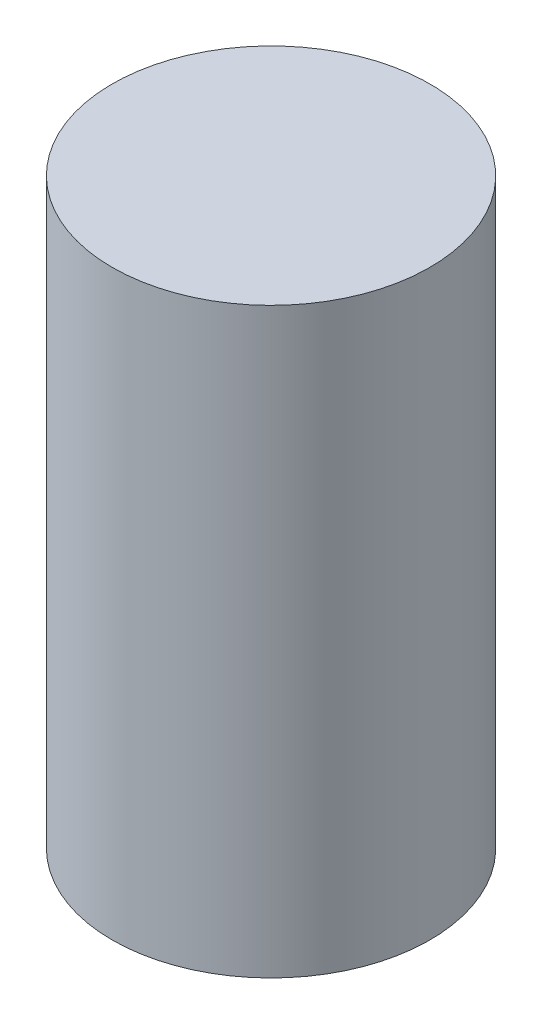
ISO-10303-21;
HEADER;
FILE_DESCRIPTION(('STEP AP214'),'2;1');
FILE_NAME('part.step','',(''),(''),'','','');
FILE_SCHEMA(('AUTOMOTIVE_DESIGN { 1 0 10303 214 1 1 1 1 }'));
ENDSEC;
DATA;
#1=APPLICATION_CONTEXT('core data for automotive mechanical design processes');
#2=APPLICATION_PROTOCOL_DEFINITION('international standard','automotive_design',2000,#1);
#3=PRODUCT_CONTEXT('',#1,'mechanical');
#4=PRODUCT('Part','Part','',(#3));
#5=PRODUCT_RELATED_PRODUCT_CATEGORY('part','',(#4));
#6=PRODUCT_DEFINITION_FORMATION('','',#4);
#7=PRODUCT_DEFINITION_CONTEXT('part definition',#1,'design');
#8=PRODUCT_DEFINITION('design','',#6,#7);
#9=PRODUCT_DEFINITION_SHAPE('','',#8);
#10=(LENGTH_UNIT() NAMED_UNIT(*) SI_UNIT(.MILLI.,.METRE.));
#11=(NAMED_UNIT(*) PLANE_ANGLE_UNIT() SI_UNIT($,.RADIAN.));
#12=(NAMED_UNIT(*) SI_UNIT($,.STERADIAN.) SOLID_ANGLE_UNIT());
#13=UNCERTAINTY_MEASURE_WITH_UNIT(LENGTH_MEASURE(1.E-05),#10,'distance_accuracy_value','');
#14=(GEOMETRIC_REPRESENTATION_CONTEXT(3) GLOBAL_UNCERTAINTY_ASSIGNED_CONTEXT((#13)) GLOBAL_UNIT_ASSIGNED_CONTEXT((#10,
#11,#12)) REPRESENTATION_CONTEXT('',''));
#15=CARTESIAN_POINT('',(0.,0.,0.));
#16=DIRECTION('',(0.,0.,1.));
#17=DIRECTION('',(1.,0.,0.));
#18=AXIS2_PLACEMENT_3D('',#15,#16,#17);
#19=CARTESIAN_POINT('',(-21.0729604242675,44.,-7.20215103107875));
#20=DIRECTION('',(0.,-1.,0.));
#21=DIRECTION('',(0.,0.,-1.));
#22=AXIS2_PLACEMENT_3D('',#19,#20,#21);
#23=CYLINDRICAL_SURFACE('',#22,12.);
#24=CARTESIAN_POINT('',(-21.0729604242675,44.,-7.20215103107875));
#25=DIRECTION('',(0.,1.,0.));
#26=DIRECTION('',(0.,0.,1.));
#27=AXIS2_PLACEMENT_3D('',#24,#25,#26);
#28=CIRCLE('',#27,12.);
#29=CARTESIAN_POINT('',(-21.0729604242675,44.,4.79784896892125));
#30=VERTEX_POINT('',#29);
#31=EDGE_CURVE('E10',#30,#30,#28,.T.);
#32=ORIENTED_EDGE('',*,*,#31,.F.);
#33=EDGE_LOOP('',(#32));
#34=FACE_BOUND('',#33,.T.);
#35=CARTESIAN_POINT('',(-21.0729604242675,0.,-7.20215103107875));
#36=DIRECTION('',(0.,1.,0.));
#37=DIRECTION('',(0.,0.,1.));
#38=AXIS2_PLACEMENT_3D('',#35,#36,#37);
#39=CIRCLE('',#38,12.);
#40=CARTESIAN_POINT('',(-21.0729604242675,0.,4.79784896892125));
#41=VERTEX_POINT('',#40);
#42=EDGE_CURVE('E35',#41,#41,#39,.T.);
#43=ORIENTED_EDGE('',*,*,#42,.T.);
#44=EDGE_LOOP('',(#43));
#45=FACE_BOUND('',#44,.T.);
#46=ADVANCED_FACE('F32',(#34,#45),#23,.T.);
#47=CARTESIAN_POINT('',(-21.0729604242675,44.,-7.20215103107875));
#48=DIRECTION('',(0.,1.,0.));
#49=DIRECTION('',(0.,0.,1.));
#50=AXIS2_PLACEMENT_3D('',#47,#48,#49);
#51=PLANE('',#50);
#52=ORIENTED_EDGE('',*,*,#31,.T.);
#53=EDGE_LOOP('',(#52));
#54=FACE_BOUND('',#53,.T.);
#55=ADVANCED_FACE('F47',(#54),#51,.T.);
#56=CARTESIAN_POINT('',(-21.0729604242675,0.,-7.20215103107875));
#57=DIRECTION('',(0.,1.,0.));
#58=DIRECTION('',(0.,0.,1.));
#59=AXIS2_PLACEMENT_3D('',#56,#57,#58);
#60=PLANE('',#59);
#61=ORIENTED_EDGE('',*,*,#42,.F.);
#62=EDGE_LOOP('',(#61));
#63=FACE_BOUND('',#62,.T.);
#64=ADVANCED_FACE('F45',(#63),#60,.F.);
#65=CLOSED_SHELL('',(#46,#55,#64));
#66=MANIFOLD_SOLID_BREP('B2',#65);
#67=ADVANCED_BREP_SHAPE_REPRESENTATION('',(#18,#66),#14);
#68=SHAPE_DEFINITION_REPRESENTATION(#9,#67);
ENDSEC;
END-ISO-10303-21;
